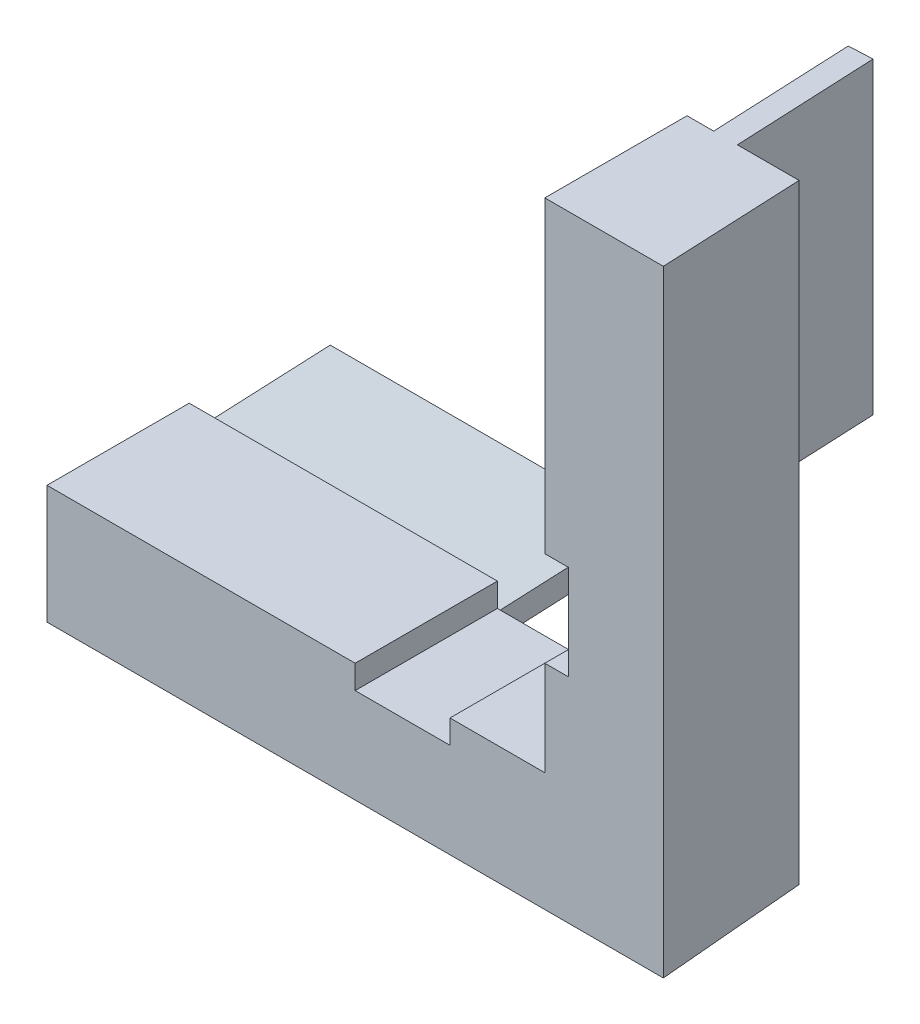
ISO-10303-21;
HEADER;
FILE_DESCRIPTION(('STEP AP214'),'2;1');
FILE_NAME('part.step','',(''),(''),'','','');
FILE_SCHEMA(('AUTOMOTIVE_DESIGN { 1 0 10303 214 1 1 1 1 }'));
ENDSEC;
DATA;
#1=APPLICATION_CONTEXT('core data for automotive mechanical design processes');
#2=APPLICATION_PROTOCOL_DEFINITION('international standard','automotive_design',2000,#1);
#3=PRODUCT_CONTEXT('',#1,'mechanical');
#4=PRODUCT('Part','Part','',(#3));
#5=PRODUCT_RELATED_PRODUCT_CATEGORY('part','',(#4));
#6=PRODUCT_DEFINITION_FORMATION('','',#4);
#7=PRODUCT_DEFINITION_CONTEXT('part definition',#1,'design');
#8=PRODUCT_DEFINITION('design','',#6,#7);
#9=PRODUCT_DEFINITION_SHAPE('','',#8);
#10=(LENGTH_UNIT() NAMED_UNIT(*) SI_UNIT(.MILLI.,.METRE.));
#11=(NAMED_UNIT(*) PLANE_ANGLE_UNIT() SI_UNIT($,.RADIAN.));
#12=(NAMED_UNIT(*) SI_UNIT($,.STERADIAN.) SOLID_ANGLE_UNIT());
#13=UNCERTAINTY_MEASURE_WITH_UNIT(LENGTH_MEASURE(1.E-05),#10,'distance_accuracy_value','');
#14=(GEOMETRIC_REPRESENTATION_CONTEXT(3) GLOBAL_UNCERTAINTY_ASSIGNED_CONTEXT((#13)) GLOBAL_UNIT_ASSIGNED_CONTEXT((#10,
#11,#12)) REPRESENTATION_CONTEXT('',''));
#15=CARTESIAN_POINT('',(0.,0.,0.));
#16=DIRECTION('',(0.,0.,1.));
#17=DIRECTION('',(1.,0.,0.));
#18=AXIS2_PLACEMENT_3D('',#15,#16,#17);
#19=CARTESIAN_POINT('',(152.5,0.,0.));
#20=DIRECTION('',(1.,0.,0.));
#21=DIRECTION('',(0.,1.,0.));
#22=AXIS2_PLACEMENT_3D('',#19,#20,#21);
#23=PLANE('',#22);
#24=DIRECTION('',(0.,1.,0.));
#25=VECTOR('',#24,1.);
#26=CARTESIAN_POINT('',(152.5,0.,844.));
#27=LINE('',#26,#25);
#28=CARTESIAN_POINT('',(152.5,41.878231424485,844.));
#29=VERTEX_POINT('',#28);
#30=CARTESIAN_POINT('',(152.5,47.5,844.));
#31=VERTEX_POINT('',#30);
#32=EDGE_CURVE('E335',#29,#31,#27,.T.);
#33=ORIENTED_EDGE('',*,*,#32,.F.);
#34=DIRECTION('',(0.,-0.0457187346435418,0.998954351961386));
#35=VECTOR('',#34,1.);
#36=CARTESIAN_POINT('',(152.5,41.7306132675467,847.225456729102));
#37=LINE('',#36,#35);
#38=CARTESIAN_POINT('',(152.5,43.2393315107836,814.259963114376));
#39=VERTEX_POINT('',#38);
#40=EDGE_CURVE('E331',#39,#29,#37,.T.);
#41=ORIENTED_EDGE('',*,*,#40,.F.);
#42=DIRECTION('',(0.,0.998954351961386,0.0457187346435406));
#43=VECTOR('',#42,1.);
#44=CARTESIAN_POINT('',(152.5,-37.0976299453681,810.583214306315));
#45=LINE('',#44,#43);
#46=CARTESIAN_POINT('',(152.5,38.2445597509767,814.031369441159));
#47=VERTEX_POINT('',#46);
#48=EDGE_CURVE('E313',#47,#39,#45,.T.);
#49=ORIENTED_EDGE('',*,*,#48,.F.);
#50=DIRECTION('',(0.,-0.0457187346435418,0.998954351961386));
#51=VECTOR('',#50,1.);
#52=CARTESIAN_POINT('',(152.5,36.7358415077398,846.996863055884));
#53=LINE('',#52,#51);
#54=CARTESIAN_POINT('',(152.5,36.8729977116704,844.));
#55=VERTEX_POINT('',#54);
#56=EDGE_CURVE('E11',#47,#55,#53,.T.);
#57=ORIENTED_EDGE('',*,*,#56,.T.);
#58=CARTESIAN_POINT('',(152.5,23.8729977116705,844.));
#59=VERTEX_POINT('',#58);
#60=EDGE_CURVE('E49',#59,#55,#27,.T.);
#61=ORIENTED_EDGE('',*,*,#60,.F.);
#62=DIRECTION('',(0.,0.0457187346435418,-0.998954351961386));
#63=VECTOR('',#62,1.);
#64=CARTESIAN_POINT('',(152.5,62.3693623314121,2.85443305864586));
#65=LINE('',#64,#63);
#66=CARTESIAN_POINT('',(152.5,22.5,874.));
#67=VERTEX_POINT('',#66);
#68=EDGE_CURVE('E333',#67,#59,#65,.T.);
#69=ORIENTED_EDGE('',*,*,#68,.F.);
#70=DIRECTION('',(0.,-1.,0.));
#71=VECTOR('',#70,1.);
#72=CARTESIAN_POINT('',(152.5,0.,874.));
#73=LINE('',#72,#71);
#74=CARTESIAN_POINT('',(152.5,47.5,874.));
#75=VERTEX_POINT('',#74);
#76=EDGE_CURVE('E336',#75,#67,#73,.T.);
#77=ORIENTED_EDGE('',*,*,#76,.F.);
#78=DIRECTION('',(0.,0.,1.));
#79=VECTOR('',#78,1.);
#80=CARTESIAN_POINT('',(152.5,47.5,843.999975));
#81=LINE('',#80,#79);
#82=EDGE_CURVE('E36',#31,#75,#81,.T.);
#83=ORIENTED_EDGE('',*,*,#82,.F.);
#84=EDGE_LOOP('',(#33,#41,#49,#57,#61,#69,#77,#83));
#85=FACE_BOUND('',#84,.T.);
#86=ADVANCED_FACE('F32',(#85),#23,.F.);
#87=CARTESIAN_POINT('',(0.,152.5,0.));
#88=DIRECTION('',(0.,1.,0.));
#89=DIRECTION('',(-1.,0.,0.));
#90=AXIS2_PLACEMENT_3D('',#87,#88,#89);
#91=PLANE('',#90);
#92=DIRECTION('',(0.,0.,1.));
#93=VECTOR('',#92,1.);
#94=CARTESIAN_POINT('',(257.5,152.5,843.999975));
#95=LINE('',#94,#93);
#96=CARTESIAN_POINT('',(257.5,152.5,844.));
#97=VERTEX_POINT('',#96);
#98=CARTESIAN_POINT('',(257.5,152.5,874.));
#99=VERTEX_POINT('',#98);
#100=EDGE_CURVE('E326',#97,#99,#95,.T.);
#101=ORIENTED_EDGE('',*,*,#100,.T.);
#102=DIRECTION('',(1.,0.,0.));
#103=VECTOR('',#102,1.);
#104=CARTESIAN_POINT('',(0.,152.5,874.));
#105=LINE('',#104,#103);
#106=CARTESIAN_POINT('',(282.5,152.5,874.));
#107=VERTEX_POINT('',#106);
#108=EDGE_CURVE('E322',#99,#107,#105,.T.);
#109=ORIENTED_EDGE('',*,*,#108,.T.);
#110=DIRECTION('',(-0.0457187346435417,0.,-0.998954351961386));
#111=VECTOR('',#110,1.);
#112=CARTESIAN_POINT('',(241.993125845879,152.5,-11.0752002675459));
#113=LINE('',#112,#111);
#114=CARTESIAN_POINT('',(281.12700228833,152.5,844.));
#115=VERTEX_POINT('',#114);
#116=EDGE_CURVE('E41',#107,#115,#113,.T.);
#117=ORIENTED_EDGE('',*,*,#116,.T.);
#118=DIRECTION('',(-1.,0.,0.));
#119=VECTOR('',#118,1.);
#120=CARTESIAN_POINT('',(0.,152.5,844.));
#121=LINE('',#120,#119);
#122=CARTESIAN_POINT('',(268.12700228833,152.5,844.));
#123=VERTEX_POINT('',#122);
#124=EDGE_CURVE('E323',#115,#123,#121,.T.);
#125=ORIENTED_EDGE('',*,*,#124,.T.);
#126=DIRECTION('',(0.0457187346435417,0.,0.998954351961386));
#127=VECTOR('',#126,1.);
#128=CARTESIAN_POINT('',(266.755440249023,152.5,814.031369441159));
#129=LINE('',#128,#127);
#130=CARTESIAN_POINT('',(266.755440249023,152.5,814.031369441159));
#131=VERTEX_POINT('',#130);
#132=EDGE_CURVE('E315',#131,#123,#129,.T.);
#133=ORIENTED_EDGE('',*,*,#132,.F.);
#134=DIRECTION('',(0.998954351961386,0.,-0.0457187346435404));
#135=VECTOR('',#134,1.);
#136=CARTESIAN_POINT('',(37.735141768077,152.5,824.512847632506));
#137=LINE('',#136,#135);
#138=CARTESIAN_POINT('',(261.760668489216,152.5,814.259963114376));
#139=VERTEX_POINT('',#138);
#140=EDGE_CURVE('E317',#139,#131,#137,.T.);
#141=ORIENTED_EDGE('',*,*,#140,.F.);
#142=DIRECTION('',(-0.0457187346435417,0.,-0.998954351961386));
#143=VECTOR('',#142,1.);
#144=CARTESIAN_POINT('',(261.760668489216,152.5,814.259963114376));
#145=LINE('',#144,#143);
#146=CARTESIAN_POINT('',(263.121768575515,152.5,844.));
#147=VERTEX_POINT('',#146);
#148=EDGE_CURVE('E191',#147,#139,#145,.T.);
#149=ORIENTED_EDGE('',*,*,#148,.F.);
#150=EDGE_CURVE('E319',#147,#97,#121,.T.);
#151=ORIENTED_EDGE('',*,*,#150,.T.);
#152=EDGE_LOOP('',(#101,#109,#117,#125,#133,#141,#149,#151));
#153=FACE_BOUND('',#152,.T.);
#154=ADVANCED_FACE('F34',(#153),#91,.T.);
#155=CARTESIAN_POINT('',(0.,0.,844.));
#156=DIRECTION('',(0.,0.,1.));
#157=DIRECTION('',(1.,0.,0.));
#158=AXIS2_PLACEMENT_3D('',#155,#156,#157);
#159=PLANE('',#158);
#160=ORIENTED_EDGE('',*,*,#124,.F.);
#161=DIRECTION('',(0.,1.,0.));
#162=VECTOR('',#161,1.);
#163=CARTESIAN_POINT('',(281.12700228833,1.20043719532443E-13,844.));
#164=LINE('',#163,#162);
#165=CARTESIAN_POINT('',(281.12700228833,23.8729977116704,844.));
#166=VERTEX_POINT('',#165);
#167=EDGE_CURVE('E56',#166,#115,#164,.T.);
#168=ORIENTED_EDGE('',*,*,#167,.F.);
#169=DIRECTION('',(1.,0.,0.));
#170=VECTOR('',#169,1.);
#171=CARTESIAN_POINT('',(0.,23.8729977116705,844.));
#172=LINE('',#171,#170);
#173=EDGE_CURVE('E411',#59,#166,#172,.T.);
#174=ORIENTED_EDGE('',*,*,#173,.F.);
#175=ORIENTED_EDGE('',*,*,#60,.T.);
#176=DIRECTION('',(1.,0.,0.));
#177=VECTOR('',#176,1.);
#178=CARTESIAN_POINT('',(0.,36.8729977116704,844.));
#179=LINE('',#178,#177);
#180=CARTESIAN_POINT('',(217.5,36.8729977116704,844.));
#181=VERTEX_POINT('',#180);
#182=EDGE_CURVE('E412',#55,#181,#179,.T.);
#183=ORIENTED_EDGE('',*,*,#182,.T.);
#184=DIRECTION('',(0.,-1.,0.));
#185=VECTOR('',#184,1.);
#186=CARTESIAN_POINT('',(217.5,0.,844.));
#187=LINE('',#186,#185);
#188=CARTESIAN_POINT('',(217.5,41.878231424485,844.));
#189=VERTEX_POINT('',#188);
#190=EDGE_CURVE('E394',#189,#181,#187,.T.);
#191=ORIENTED_EDGE('',*,*,#190,.F.);
#192=DIRECTION('',(1.,0.,0.));
#193=VECTOR('',#192,1.);
#194=CARTESIAN_POINT('',(0.,41.878231424485,844.));
#195=LINE('',#194,#193);
#196=EDGE_CURVE('E349',#29,#189,#195,.T.);
#197=ORIENTED_EDGE('',*,*,#196,.F.);
#198=ORIENTED_EDGE('',*,*,#32,.T.);
#199=DIRECTION('',(1.,0.,0.));
#200=VECTOR('',#199,1.);
#201=CARTESIAN_POINT('',(0.,47.5,844.));
#202=LINE('',#201,#200);
#203=CARTESIAN_POINT('',(217.5,47.5,844.));
#204=VERTEX_POINT('',#203);
#205=EDGE_CURVE('E293',#31,#204,#202,.T.);
#206=ORIENTED_EDGE('',*,*,#205,.T.);
#207=DIRECTION('',(0.,1.,0.));
#208=VECTOR('',#207,1.);
#209=CARTESIAN_POINT('',(217.5,42.5,844.));
#210=LINE('',#209,#208);
#211=CARTESIAN_POINT('',(217.5,42.5,844.));
#212=VERTEX_POINT('',#211);
#213=EDGE_CURVE('E252',#212,#204,#210,.T.);
#214=ORIENTED_EDGE('',*,*,#213,.F.);
#215=DIRECTION('',(-1.,0.,0.));
#216=VECTOR('',#215,1.);
#217=CARTESIAN_POINT('',(237.5,42.5,844.));
#218=LINE('',#217,#216);
#219=CARTESIAN_POINT('',(237.5,42.5,844.));
#220=VERTEX_POINT('',#219);
#221=EDGE_CURVE('E232',#220,#212,#218,.T.);
#222=ORIENTED_EDGE('',*,*,#221,.F.);
#223=DIRECTION('',(0.,1.,0.));
#224=VECTOR('',#223,1.);
#225=CARTESIAN_POINT('',(237.5,42.5,844.));
#226=LINE('',#225,#224);
#227=CARTESIAN_POINT('',(237.5,47.5,844.));
#228=VERTEX_POINT('',#227);
#229=EDGE_CURVE('E242',#220,#228,#226,.T.);
#230=ORIENTED_EDGE('',*,*,#229,.T.);
#231=CARTESIAN_POINT('',(257.5,47.5,844.));
#232=VERTEX_POINT('',#231);
#233=EDGE_CURVE('E292',#228,#232,#202,.T.);
#234=ORIENTED_EDGE('',*,*,#233,.T.);
#235=DIRECTION('',(0.,1.,0.));
#236=VECTOR('',#235,1.);
#237=CARTESIAN_POINT('',(257.5,0.,844.));
#238=LINE('',#237,#236);
#239=CARTESIAN_POINT('',(257.5,67.5,844.));
#240=VERTEX_POINT('',#239);
#241=EDGE_CURVE('E296',#232,#240,#238,.T.);
#242=ORIENTED_EDGE('',*,*,#241,.T.);
#243=DIRECTION('',(-1.,0.,0.));
#244=VECTOR('',#243,1.);
#245=CARTESIAN_POINT('',(262.5,67.5,844.));
#246=LINE('',#245,#244);
#247=CARTESIAN_POINT('',(262.5,67.5,844.));
#248=VERTEX_POINT('',#247);
#249=EDGE_CURVE('E277',#248,#240,#246,.T.);
#250=ORIENTED_EDGE('',*,*,#249,.F.);
#251=DIRECTION('',(0.,1.,0.));
#252=VECTOR('',#251,1.);
#253=CARTESIAN_POINT('',(262.5,87.5,844.));
#254=LINE('',#253,#252);
#255=CARTESIAN_POINT('',(262.5,87.5,844.));
#256=VERTEX_POINT('',#255);
#257=EDGE_CURVE('E263',#248,#256,#254,.T.);
#258=ORIENTED_EDGE('',*,*,#257,.T.);
#259=DIRECTION('',(-1.,0.,0.));
#260=VECTOR('',#259,1.);
#261=CARTESIAN_POINT('',(262.5,87.5,844.));
#262=LINE('',#261,#260);
#263=CARTESIAN_POINT('',(257.5,87.5,844.));
#264=VERTEX_POINT('',#263);
#265=EDGE_CURVE('E274',#256,#264,#262,.T.);
#266=ORIENTED_EDGE('',*,*,#265,.T.);
#267=EDGE_CURVE('E295',#264,#97,#238,.T.);
#268=ORIENTED_EDGE('',*,*,#267,.T.);
#269=ORIENTED_EDGE('',*,*,#150,.F.);
#270=DIRECTION('',(0.,-1.,0.));
#271=VECTOR('',#270,1.);
#272=CARTESIAN_POINT('',(263.121768575515,0.,844.));
#273=LINE('',#272,#271);
#274=CARTESIAN_POINT('',(263.121768575515,87.5,844.));
#275=VERTEX_POINT('',#274);
#276=EDGE_CURVE('E393',#147,#275,#273,.T.);
#277=ORIENTED_EDGE('',*,*,#276,.T.);
#278=DIRECTION('',(1.,0.,0.));
#279=VECTOR('',#278,1.);
#280=CARTESIAN_POINT('',(0.,87.5,844.));
#281=LINE('',#280,#279);
#282=CARTESIAN_POINT('',(268.12700228833,87.5,844.));
#283=VERTEX_POINT('',#282);
#284=EDGE_CURVE('E202',#275,#283,#281,.T.);
#285=ORIENTED_EDGE('',*,*,#284,.T.);
#286=DIRECTION('',(0.,1.,0.));
#287=VECTOR('',#286,1.);
#288=CARTESIAN_POINT('',(268.12700228833,217.5,844.));
#289=LINE('',#288,#287);
#290=EDGE_CURVE('E211',#283,#123,#289,.T.);
#291=ORIENTED_EDGE('',*,*,#290,.T.);
#292=EDGE_LOOP('',(#160,#168,#174,#175,#183,#191,#197,#198,#206,#214,#222,#230,#234,#242,#250,
#258,#266,#268,#269,#277,#285,#291));
#293=FACE_BOUND('',#292,.T.);
#294=ADVANCED_FACE('F346',(#293),#159,.F.);
#295=CARTESIAN_POINT('',(0.,0.,874.));
#296=DIRECTION('',(0.,0.,-1.));
#297=DIRECTION('',(-1.,0.,0.));
#298=AXIS2_PLACEMENT_3D('',#295,#296,#297);
#299=PLANE('',#298);
#300=ORIENTED_EDGE('',*,*,#108,.F.);
#301=DIRECTION('',(0.,1.,0.));
#302=VECTOR('',#301,1.);
#303=CARTESIAN_POINT('',(257.5,257.5,874.));
#304=LINE('',#303,#302);
#305=CARTESIAN_POINT('',(257.5,87.5,874.));
#306=VERTEX_POINT('',#305);
#307=EDGE_CURVE('E285',#306,#99,#304,.T.);
#308=ORIENTED_EDGE('',*,*,#307,.F.);
#309=DIRECTION('',(-1.,0.,0.));
#310=VECTOR('',#309,1.);
#311=CARTESIAN_POINT('',(262.5,87.5,874.));
#312=LINE('',#311,#310);
#313=CARTESIAN_POINT('',(262.5,87.5,874.));
#314=VERTEX_POINT('',#313);
#315=EDGE_CURVE('E268',#314,#306,#312,.T.);
#316=ORIENTED_EDGE('',*,*,#315,.F.);
#317=DIRECTION('',(0.,-1.,0.));
#318=VECTOR('',#317,1.);
#319=CARTESIAN_POINT('',(262.5,87.5,874.));
#320=LINE('',#319,#318);
#321=CARTESIAN_POINT('',(262.5,67.5,874.));
#322=VERTEX_POINT('',#321);
#323=EDGE_CURVE('E257',#314,#322,#320,.T.);
#324=ORIENTED_EDGE('',*,*,#323,.T.);
#325=DIRECTION('',(-1.,0.,0.));
#326=VECTOR('',#325,1.);
#327=CARTESIAN_POINT('',(262.5,67.5,874.));
#328=LINE('',#327,#326);
#329=CARTESIAN_POINT('',(257.5,67.5,874.));
#330=VERTEX_POINT('',#329);
#331=EDGE_CURVE('E279',#322,#330,#328,.T.);
#332=ORIENTED_EDGE('',*,*,#331,.T.);
#333=CARTESIAN_POINT('',(257.5,47.5,874.));
#334=VERTEX_POINT('',#333);
#335=EDGE_CURVE('E286',#334,#330,#304,.T.);
#336=ORIENTED_EDGE('',*,*,#335,.F.);
#337=DIRECTION('',(1.,0.,0.));
#338=VECTOR('',#337,1.);
#339=CARTESIAN_POINT('',(47.5,47.5,874.));
#340=LINE('',#339,#338);
#341=CARTESIAN_POINT('',(237.5,47.5,874.));
#342=VERTEX_POINT('',#341);
#343=EDGE_CURVE('E282',#342,#334,#340,.T.);
#344=ORIENTED_EDGE('',*,*,#343,.F.);
#345=DIRECTION('',(0.,1.,0.));
#346=VECTOR('',#345,1.);
#347=CARTESIAN_POINT('',(237.5,42.5,874.));
#348=LINE('',#347,#346);
#349=CARTESIAN_POINT('',(237.5,42.5,874.));
#350=VERTEX_POINT('',#349);
#351=EDGE_CURVE('E246',#350,#342,#348,.T.);
#352=ORIENTED_EDGE('',*,*,#351,.F.);
#353=DIRECTION('',(1.,0.,0.));
#354=VECTOR('',#353,1.);
#355=CARTESIAN_POINT('',(237.5,42.5,874.));
#356=LINE('',#355,#354);
#357=CARTESIAN_POINT('',(217.5,42.5,874.));
#358=VERTEX_POINT('',#357);
#359=EDGE_CURVE('E239',#358,#350,#356,.T.);
#360=ORIENTED_EDGE('',*,*,#359,.F.);
#361=DIRECTION('',(0.,1.,0.));
#362=VECTOR('',#361,1.);
#363=CARTESIAN_POINT('',(217.5,42.5,874.));
#364=LINE('',#363,#362);
#365=CARTESIAN_POINT('',(217.5,47.5,874.));
#366=VERTEX_POINT('',#365);
#367=EDGE_CURVE('E249',#358,#366,#364,.T.);
#368=ORIENTED_EDGE('',*,*,#367,.T.);
#369=EDGE_CURVE('E283',#75,#366,#340,.T.);
#370=ORIENTED_EDGE('',*,*,#369,.F.);
#371=ORIENTED_EDGE('',*,*,#76,.T.);
#372=DIRECTION('',(1.,0.,0.));
#373=VECTOR('',#372,1.);
#374=CARTESIAN_POINT('',(22.5,22.5,874.));
#375=LINE('',#374,#373);
#376=CARTESIAN_POINT('',(282.5,22.5,874.));
#377=VERTEX_POINT('',#376);
#378=EDGE_CURVE('E299',#67,#377,#375,.T.);
#379=ORIENTED_EDGE('',*,*,#378,.T.);
#380=DIRECTION('',(0.,1.,0.));
#381=VECTOR('',#380,1.);
#382=CARTESIAN_POINT('',(282.5,282.5,874.));
#383=LINE('',#382,#381);
#384=EDGE_CURVE('E300',#377,#107,#383,.T.);
#385=ORIENTED_EDGE('',*,*,#384,.T.);
#386=EDGE_LOOP('',(#300,#308,#316,#324,#332,#336,#344,#352,#360,#368,#370,#371,#379,#385));
#387=FACE_BOUND('',#386,.T.);
#388=ADVANCED_FACE('F358',(#387),#299,.F.);
#389=CARTESIAN_POINT('',(257.5,257.5,843.999975));
#390=DIRECTION('',(1.,0.,0.));
#391=DIRECTION('',(0.,1.,0.));
#392=AXIS2_PLACEMENT_3D('',#389,#390,#391);
#393=PLANE('',#392);
#394=ORIENTED_EDGE('',*,*,#100,.F.);
#395=ORIENTED_EDGE('',*,*,#267,.F.);
#396=DIRECTION('',(0.,0.,1.));
#397=VECTOR('',#396,1.);
#398=CARTESIAN_POINT('',(257.5,87.5,874.));
#399=LINE('',#398,#397);
#400=EDGE_CURVE('E261',#264,#306,#399,.T.);
#401=ORIENTED_EDGE('',*,*,#400,.T.);
#402=ORIENTED_EDGE('',*,*,#307,.T.);
#403=EDGE_LOOP('',(#394,#395,#401,#402));
#404=FACE_BOUND('',#403,.T.);
#405=ADVANCED_FACE('F390',(#404),#393,.F.);
#406=CARTESIAN_POINT('',(241.993125845879,1.0333320773658E-13,-11.075200267546));
#407=DIRECTION('',(-0.998954351961386,0.,0.0457187346435417));
#408=DIRECTION('',(0.0457187346435417,0.,0.998954351961386));
#409=AXIS2_PLACEMENT_3D('',#406,#407,#408);
#410=PLANE('',#409);
#411=ORIENTED_EDGE('',*,*,#116,.F.);
#412=ORIENTED_EDGE('',*,*,#384,.F.);
#413=DIRECTION('',(0.0456710287056021,-0.0456710287056019,0.997911977217402));
#414=VECTOR('',#413,1.);
#415=CARTESIAN_POINT('',(242.5,62.5,0.));
#416=LINE('',#415,#414);
#417=EDGE_CURVE('E303',#166,#377,#416,.T.);
#418=ORIENTED_EDGE('',*,*,#417,.F.);
#419=ORIENTED_EDGE('',*,*,#167,.T.);
#420=EDGE_LOOP('',(#411,#412,#418,#419));
#421=FACE_BOUND('',#420,.T.);
#422=ADVANCED_FACE('F406',(#421),#410,.F.);
#423=CARTESIAN_POINT('',(261.760668489216,217.5,814.259963114376));
#424=DIRECTION('',(-0.998954351961386,0.,0.0457187346435417));
#425=DIRECTION('',(0.0457187346435417,0.,0.998954351961386));
#426=AXIS2_PLACEMENT_3D('',#423,#424,#425);
#427=PLANE('',#426);
#428=ORIENTED_EDGE('',*,*,#276,.F.);
#429=ORIENTED_EDGE('',*,*,#148,.T.);
#430=DIRECTION('',(0.,-1.,0.));
#431=VECTOR('',#430,1.);
#432=CARTESIAN_POINT('',(261.760668489216,217.5,814.259963114376));
#433=LINE('',#432,#431);
#434=CARTESIAN_POINT('',(261.760668489216,87.5,814.259963114376));
#435=VERTEX_POINT('',#434);
#436=EDGE_CURVE('E186',#139,#435,#433,.T.);
#437=ORIENTED_EDGE('',*,*,#436,.T.);
#438=DIRECTION('',(0.0457187346435417,0.,0.998954351961386));
#439=VECTOR('',#438,1.);
#440=CARTESIAN_POINT('',(261.760668489216,87.5,814.259963114376));
#441=LINE('',#440,#439);
#442=EDGE_CURVE('E190',#435,#275,#441,.T.);
#443=ORIENTED_EDGE('',*,*,#442,.T.);
#444=EDGE_LOOP('',(#428,#429,#437,#443));
#445=FACE_BOUND('',#444,.T.);
#446=ADVANCED_FACE('F189',(#445),#427,.T.);
#447=CARTESIAN_POINT('',(266.755440249023,217.5,814.031369441159));
#448=DIRECTION('',(0.998954351961386,0.,-0.0457187346435417));
#449=DIRECTION('',(-0.0457187346435417,0.,-0.998954351961386));
#450=AXIS2_PLACEMENT_3D('',#447,#448,#449);
#451=PLANE('',#450);
#452=DIRECTION('',(0.,1.,0.));
#453=VECTOR('',#452,1.);
#454=CARTESIAN_POINT('',(266.755440249023,217.5,814.031369441159));
#455=LINE('',#454,#453);
#456=CARTESIAN_POINT('',(266.755440249023,87.5,814.031369441159));
#457=VERTEX_POINT('',#456);
#458=EDGE_CURVE('E195',#457,#131,#455,.T.);
#459=ORIENTED_EDGE('',*,*,#458,.T.);
#460=ORIENTED_EDGE('',*,*,#132,.T.);
#461=ORIENTED_EDGE('',*,*,#290,.F.);
#462=DIRECTION('',(0.0457187346435417,0.,0.998954351961386));
#463=VECTOR('',#462,1.);
#464=CARTESIAN_POINT('',(266.755440249023,87.5,814.031369441159));
#465=LINE('',#464,#463);
#466=EDGE_CURVE('E203',#457,#283,#465,.T.);
#467=ORIENTED_EDGE('',*,*,#466,.F.);
#468=EDGE_LOOP('',(#459,#460,#461,#467));
#469=FACE_BOUND('',#468,.T.);
#470=ADVANCED_FACE('F404',(#469),#451,.T.);
#471=CARTESIAN_POINT('',(37.735141768077,0.,824.512847632506));
#472=DIRECTION('',(-0.0457187346435404,0.,-0.998954351961386));
#473=DIRECTION('',(-0.998954351961386,0.,0.0457187346435404));
#474=AXIS2_PLACEMENT_3D('',#471,#472,#473);
#475=PLANE('',#474);
#476=ORIENTED_EDGE('',*,*,#436,.F.);
#477=ORIENTED_EDGE('',*,*,#140,.T.);
#478=ORIENTED_EDGE('',*,*,#458,.F.);
#479=DIRECTION('',(0.998954351961386,0.,-0.0457187346435404));
#480=VECTOR('',#479,1.);
#481=CARTESIAN_POINT('',(266.755440249023,87.5,814.031369441159));
#482=LINE('',#481,#480);
#483=EDGE_CURVE('E194',#435,#457,#482,.T.);
#484=ORIENTED_EDGE('',*,*,#483,.F.);
#485=EDGE_LOOP('',(#476,#477,#478,#484));
#486=FACE_BOUND('',#485,.T.);
#487=ADVANCED_FACE('F206',(#486),#475,.T.);
#488=CARTESIAN_POINT('',(47.5,47.5,843.999975));
#489=DIRECTION('',(0.,-1.,0.));
#490=DIRECTION('',(0.,0.,-1.));
#491=AXIS2_PLACEMENT_3D('',#488,#489,#490);
#492=PLANE('',#491);
#493=ORIENTED_EDGE('',*,*,#205,.F.);
#494=ORIENTED_EDGE('',*,*,#82,.T.);
#495=ORIENTED_EDGE('',*,*,#369,.T.);
#496=DIRECTION('',(0.,0.,1.));
#497=VECTOR('',#496,1.);
#498=CARTESIAN_POINT('',(217.5,47.5,844.));
#499=LINE('',#498,#497);
#500=EDGE_CURVE('E233',#204,#366,#499,.T.);
#501=ORIENTED_EDGE('',*,*,#500,.F.);
#502=EDGE_LOOP('',(#493,#494,#495,#501));
#503=FACE_BOUND('',#502,.T.);
#504=ADVANCED_FACE('F353',(#503),#492,.F.);
#505=ORIENTED_EDGE('',*,*,#233,.F.);
#506=DIRECTION('',(0.,0.,-1.));
#507=VECTOR('',#506,1.);
#508=CARTESIAN_POINT('',(237.5,47.5,844.));
#509=LINE('',#508,#507);
#510=EDGE_CURVE('E228',#342,#228,#509,.T.);
#511=ORIENTED_EDGE('',*,*,#510,.F.);
#512=ORIENTED_EDGE('',*,*,#343,.T.);
#513=DIRECTION('',(0.,0.,1.));
#514=VECTOR('',#513,1.);
#515=CARTESIAN_POINT('',(257.5,47.5,843.999975));
#516=LINE('',#515,#514);
#517=EDGE_CURVE('E289',#232,#334,#516,.T.);
#518=ORIENTED_EDGE('',*,*,#517,.F.);
#519=EDGE_LOOP('',(#505,#511,#512,#518));
#520=FACE_BOUND('',#519,.T.);
#521=ADVANCED_FACE('F369',(#520),#492,.F.);
#522=DIRECTION('',(0.,0.,-1.));
#523=VECTOR('',#522,1.);
#524=CARTESIAN_POINT('',(257.5,67.5,874.));
#525=LINE('',#524,#523);
#526=EDGE_CURVE('E248',#330,#240,#525,.T.);
#527=ORIENTED_EDGE('',*,*,#526,.T.);
#528=ORIENTED_EDGE('',*,*,#241,.F.);
#529=ORIENTED_EDGE('',*,*,#517,.T.);
#530=ORIENTED_EDGE('',*,*,#335,.T.);
#531=EDGE_LOOP('',(#527,#528,#529,#530));
#532=FACE_BOUND('',#531,.T.);
#533=ADVANCED_FACE('F373',(#532),#393,.F.);
#534=CARTESIAN_POINT('',(0.,62.3693623314121,2.85443305864586));
#535=DIRECTION('',(0.,0.998954351961386,0.0457187346435418));
#536=DIRECTION('',(0.,-0.0457187346435418,0.998954351961386));
#537=AXIS2_PLACEMENT_3D('',#534,#535,#536);
#538=PLANE('',#537);
#539=ORIENTED_EDGE('',*,*,#378,.F.);
#540=ORIENTED_EDGE('',*,*,#68,.T.);
#541=ORIENTED_EDGE('',*,*,#173,.T.);
#542=ORIENTED_EDGE('',*,*,#417,.T.);
#543=EDGE_LOOP('',(#539,#540,#541,#542));
#544=FACE_BOUND('',#543,.T.);
#545=ADVANCED_FACE('F410',(#544),#538,.F.);
#546=CARTESIAN_POINT('',(262.5,67.5,874.));
#547=DIRECTION('',(0.,1.,0.));
#548=DIRECTION('',(0.,0.,1.));
#549=AXIS2_PLACEMENT_3D('',#546,#547,#548);
#550=PLANE('',#549);
#551=ORIENTED_EDGE('',*,*,#526,.F.);
#552=ORIENTED_EDGE('',*,*,#331,.F.);
#553=DIRECTION('',(0.,0.,-1.));
#554=VECTOR('',#553,1.);
#555=CARTESIAN_POINT('',(262.5,67.5,874.));
#556=LINE('',#555,#554);
#557=EDGE_CURVE('E260',#322,#248,#556,.T.);
#558=ORIENTED_EDGE('',*,*,#557,.T.);
#559=ORIENTED_EDGE('',*,*,#249,.T.);
#560=EDGE_LOOP('',(#551,#552,#558,#559));
#561=FACE_BOUND('',#560,.T.);
#562=ADVANCED_FACE('F377',(#561),#550,.T.);
#563=CARTESIAN_POINT('',(262.5,87.5,874.));
#564=DIRECTION('',(0.,-1.,0.));
#565=DIRECTION('',(0.,0.,-1.));
#566=AXIS2_PLACEMENT_3D('',#563,#564,#565);
#567=PLANE('',#566);
#568=ORIENTED_EDGE('',*,*,#400,.F.);
#569=ORIENTED_EDGE('',*,*,#265,.F.);
#570=DIRECTION('',(0.,0.,1.));
#571=VECTOR('',#570,1.);
#572=CARTESIAN_POINT('',(262.5,87.5,874.));
#573=LINE('',#572,#571);
#574=EDGE_CURVE('E266',#256,#314,#573,.T.);
#575=ORIENTED_EDGE('',*,*,#574,.T.);
#576=ORIENTED_EDGE('',*,*,#315,.T.);
#577=EDGE_LOOP('',(#568,#569,#575,#576));
#578=FACE_BOUND('',#577,.T.);
#579=ADVANCED_FACE('F385',(#578),#567,.T.);
#580=CARTESIAN_POINT('',(262.5,0.,0.));
#581=DIRECTION('',(1.,0.,0.));
#582=DIRECTION('',(0.,0.,-1.));
#583=AXIS2_PLACEMENT_3D('',#580,#581,#582);
#584=PLANE('',#583);
#585=ORIENTED_EDGE('',*,*,#323,.F.);
#586=ORIENTED_EDGE('',*,*,#574,.F.);
#587=ORIENTED_EDGE('',*,*,#257,.F.);
#588=ORIENTED_EDGE('',*,*,#557,.F.);
#589=EDGE_LOOP('',(#585,#586,#587,#588));
#590=FACE_BOUND('',#589,.T.);
#591=ADVANCED_FACE('F382',(#590),#584,.F.);
#592=CARTESIAN_POINT('',(237.5,42.5,844.));
#593=DIRECTION('',(1.,0.,0.));
#594=DIRECTION('',(0.,0.,-1.));
#595=AXIS2_PLACEMENT_3D('',#592,#593,#594);
#596=PLANE('',#595);
#597=ORIENTED_EDGE('',*,*,#510,.T.);
#598=ORIENTED_EDGE('',*,*,#229,.F.);
#599=DIRECTION('',(0.,0.,-1.));
#600=VECTOR('',#599,1.);
#601=CARTESIAN_POINT('',(237.5,42.5,844.));
#602=LINE('',#601,#600);
#603=EDGE_CURVE('E229',#350,#220,#602,.T.);
#604=ORIENTED_EDGE('',*,*,#603,.F.);
#605=ORIENTED_EDGE('',*,*,#351,.T.);
#606=EDGE_LOOP('',(#597,#598,#604,#605));
#607=FACE_BOUND('',#606,.T.);
#608=ADVANCED_FACE('F453',(#607),#596,.F.);
#609=CARTESIAN_POINT('',(217.5,42.5,844.));
#610=DIRECTION('',(-1.,0.,0.));
#611=DIRECTION('',(0.,0.,1.));
#612=AXIS2_PLACEMENT_3D('',#609,#610,#611);
#613=PLANE('',#612);
#614=ORIENTED_EDGE('',*,*,#500,.T.);
#615=ORIENTED_EDGE('',*,*,#367,.F.);
#616=DIRECTION('',(0.,0.,1.));
#617=VECTOR('',#616,1.);
#618=CARTESIAN_POINT('',(217.5,42.5,844.));
#619=LINE('',#618,#617);
#620=EDGE_CURVE('E236',#212,#358,#619,.T.);
#621=ORIENTED_EDGE('',*,*,#620,.F.);
#622=ORIENTED_EDGE('',*,*,#213,.T.);
#623=EDGE_LOOP('',(#614,#615,#621,#622));
#624=FACE_BOUND('',#623,.T.);
#625=ADVANCED_FACE('F355',(#624),#613,.F.);
#626=CARTESIAN_POINT('',(0.,42.5,0.));
#627=DIRECTION('',(0.,-1.,0.));
#628=DIRECTION('',(0.,0.,-1.));
#629=AXIS2_PLACEMENT_3D('',#626,#627,#628);
#630=PLANE('',#629);
#631=ORIENTED_EDGE('',*,*,#603,.T.);
#632=ORIENTED_EDGE('',*,*,#221,.T.);
#633=ORIENTED_EDGE('',*,*,#620,.T.);
#634=ORIENTED_EDGE('',*,*,#359,.T.);
#635=EDGE_LOOP('',(#631,#632,#633,#634));
#636=FACE_BOUND('',#635,.T.);
#637=ADVANCED_FACE('F362',(#636),#630,.F.);
#638=CARTESIAN_POINT('',(217.5,36.7358415077398,846.996863055884));
#639=DIRECTION('',(-1.,0.,0.));
#640=DIRECTION('',(0.,0.,1.));
#641=AXIS2_PLACEMENT_3D('',#638,#639,#640);
#642=PLANE('',#641);
#643=DIRECTION('',(0.,0.0457187346435418,-0.998954351961386));
#644=VECTOR('',#643,1.);
#645=CARTESIAN_POINT('',(217.5,41.7306132675467,847.225456729102));
#646=LINE('',#645,#644);
#647=CARTESIAN_POINT('',(217.5,43.2393315107836,814.259963114376));
#648=VERTEX_POINT('',#647);
#649=EDGE_CURVE('E226',#189,#648,#646,.T.);
#650=ORIENTED_EDGE('',*,*,#649,.F.);
#651=ORIENTED_EDGE('',*,*,#190,.T.);
#652=DIRECTION('',(0.,0.0457187346435418,-0.998954351961386));
#653=VECTOR('',#652,1.);
#654=CARTESIAN_POINT('',(217.5,36.7358415077398,846.996863055884));
#655=LINE('',#654,#653);
#656=CARTESIAN_POINT('',(217.5,38.2445597509767,814.031369441159));
#657=VERTEX_POINT('',#656);
#658=EDGE_CURVE('E224',#181,#657,#655,.T.);
#659=ORIENTED_EDGE('',*,*,#658,.T.);
#660=DIRECTION('',(0.,0.998954351961386,0.0457187346435406));
#661=VECTOR('',#660,1.);
#662=CARTESIAN_POINT('',(217.5,38.2445597509767,814.031369441159));
#663=LINE('',#662,#661);
#664=EDGE_CURVE('E214',#657,#648,#663,.T.);
#665=ORIENTED_EDGE('',*,*,#664,.T.);
#666=EDGE_LOOP('',(#650,#651,#659,#665));
#667=FACE_BOUND('',#666,.T.);
#668=ADVANCED_FACE('F420',(#667),#642,.F.);
#669=CARTESIAN_POINT('',(217.5,41.7306132675467,847.225456729102));
#670=DIRECTION('',(0.,-0.998954351961386,-0.0457187346435418));
#671=DIRECTION('',(0.,0.0457187346435418,-0.998954351961386));
#672=AXIS2_PLACEMENT_3D('',#669,#670,#671);
#673=PLANE('',#672);
#674=DIRECTION('',(-1.,0.,0.));
#675=VECTOR('',#674,1.);
#676=CARTESIAN_POINT('',(217.5,43.2393315107836,814.259963114376));
#677=LINE('',#676,#675);
#678=EDGE_CURVE('E218',#648,#39,#677,.T.);
#679=ORIENTED_EDGE('',*,*,#678,.T.);
#680=ORIENTED_EDGE('',*,*,#40,.T.);
#681=ORIENTED_EDGE('',*,*,#196,.T.);
#682=ORIENTED_EDGE('',*,*,#649,.T.);
#683=EDGE_LOOP('',(#679,#680,#681,#682));
#684=FACE_BOUND('',#683,.T.);
#685=ADVANCED_FACE('F417',(#684),#673,.F.);
#686=CARTESIAN_POINT('',(217.5,36.7358415077398,846.996863055884));
#687=DIRECTION('',(0.,-0.998954351961386,-0.0457187346435418));
#688=DIRECTION('',(0.,0.0457187346435418,-0.998954351961386));
#689=AXIS2_PLACEMENT_3D('',#686,#687,#688);
#690=PLANE('',#689);
#691=ORIENTED_EDGE('',*,*,#56,.F.);
#692=DIRECTION('',(-1.,0.,0.));
#693=VECTOR('',#692,1.);
#694=CARTESIAN_POINT('',(217.5,38.2445597509767,814.031369441159));
#695=LINE('',#694,#693);
#696=EDGE_CURVE('E221',#657,#47,#695,.T.);
#697=ORIENTED_EDGE('',*,*,#696,.F.);
#698=ORIENTED_EDGE('',*,*,#658,.F.);
#699=ORIENTED_EDGE('',*,*,#182,.F.);
#700=EDGE_LOOP('',(#691,#697,#698,#699));
#701=FACE_BOUND('',#700,.T.);
#702=ADVANCED_FACE('F426',(#701),#690,.T.);
#703=CARTESIAN_POINT('',(0.,-37.0976299453681,810.583214306315));
#704=DIRECTION('',(0.,-0.0457187346435406,0.998954351961387));
#705=DIRECTION('',(0.,-0.998954351961386,-0.0457187346435406));
#706=AXIS2_PLACEMENT_3D('',#703,#704,#705);
#707=PLANE('',#706);
#708=ORIENTED_EDGE('',*,*,#696,.T.);
#709=ORIENTED_EDGE('',*,*,#48,.T.);
#710=ORIENTED_EDGE('',*,*,#678,.F.);
#711=ORIENTED_EDGE('',*,*,#664,.F.);
#712=EDGE_LOOP('',(#708,#709,#710,#711));
#713=FACE_BOUND('',#712,.T.);
#714=ADVANCED_FACE('F429',(#713),#707,.F.);
#715=CARTESIAN_POINT('',(266.755440249023,87.5,814.031369441159));
#716=DIRECTION('',(0.,-1.,0.));
#717=DIRECTION('',(0.,0.,-1.));
#718=AXIS2_PLACEMENT_3D('',#715,#716,#717);
#719=PLANE('',#718);
#720=ORIENTED_EDGE('',*,*,#284,.F.);
#721=ORIENTED_EDGE('',*,*,#442,.F.);
#722=ORIENTED_EDGE('',*,*,#483,.T.);
#723=ORIENTED_EDGE('',*,*,#466,.T.);
#724=EDGE_LOOP('',(#720,#721,#722,#723));
#725=FACE_BOUND('',#724,.T.);
#726=ADVANCED_FACE('F200',(#725),#719,.T.);
#727=CLOSED_SHELL('',(#86,#154,#294,#388,#405,#422,#446,#470,#487,#504,#521,#533,#545,#562,#579,
#591,#608,#625,#637,#668,#685,#702,#714,#726));
#728=MANIFOLD_SOLID_BREP('B2',#727);
#729=ADVANCED_BREP_SHAPE_REPRESENTATION('',(#18,#728),#14);
#730=SHAPE_DEFINITION_REPRESENTATION(#9,#729);
ENDSEC;
END-ISO-10303-21;
